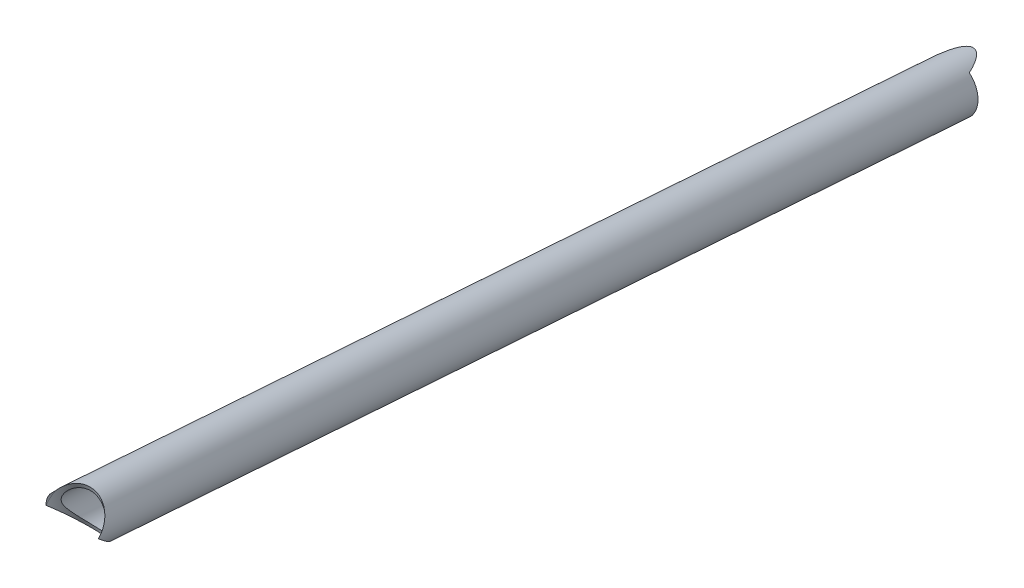
ISO-10303-21;
HEADER;
FILE_DESCRIPTION(('STEP AP214'),'2;1');
FILE_NAME('part.step','',(''),(''),'','','');
FILE_SCHEMA(('AUTOMOTIVE_DESIGN { 1 0 10303 214 1 1 1 1 }'));
ENDSEC;
DATA;
#1=APPLICATION_CONTEXT('core data for automotive mechanical design processes');
#2=APPLICATION_PROTOCOL_DEFINITION('international standard','automotive_design',2000,#1);
#3=PRODUCT_CONTEXT('',#1,'mechanical');
#4=PRODUCT('Part','Part','',(#3));
#5=PRODUCT_RELATED_PRODUCT_CATEGORY('part','',(#4));
#6=PRODUCT_DEFINITION_FORMATION('','',#4);
#7=PRODUCT_DEFINITION_CONTEXT('part definition',#1,'design');
#8=PRODUCT_DEFINITION('design','',#6,#7);
#9=PRODUCT_DEFINITION_SHAPE('','',#8);
#10=(LENGTH_UNIT() NAMED_UNIT(*) SI_UNIT(.MILLI.,.METRE.));
#11=(NAMED_UNIT(*) PLANE_ANGLE_UNIT() SI_UNIT($,.RADIAN.));
#12=(NAMED_UNIT(*) SI_UNIT($,.STERADIAN.) SOLID_ANGLE_UNIT());
#13=UNCERTAINTY_MEASURE_WITH_UNIT(LENGTH_MEASURE(1.E-05),#10,'distance_accuracy_value','');
#14=(GEOMETRIC_REPRESENTATION_CONTEXT(3) GLOBAL_UNCERTAINTY_ASSIGNED_CONTEXT((#13)) GLOBAL_UNIT_ASSIGNED_CONTEXT((#10,
#11,#12)) REPRESENTATION_CONTEXT('',''));
#15=CARTESIAN_POINT('',(0.,0.,0.));
#16=DIRECTION('',(0.,0.,1.));
#17=DIRECTION('',(1.,0.,0.));
#18=AXIS2_PLACEMENT_3D('',#15,#16,#17);
#19=CARTESIAN_POINT('',(250.,220.,-2000.));
#20=DIRECTION('',(0.171152156864514,0.228202875819352,0.958452078441276));
#21=DIRECTION('',(0.,-0.972806214685367,0.23162052730604));
#22=AXIS2_PLACEMENT_3D('',#19,#20,#21);
#23=CYLINDRICAL_SURFACE('',#22,7.90000000000002);
#24=CARTESIAN_POINT('',(322.090271514965,308.435192923939,-1594.46467735048));
#25=CARTESIAN_POINT('',(322.241784424069,308.437647561189,-1594.45437503883));
#26=CARTESIAN_POINT('',(322.392878238035,308.445696040376,-1594.43844222641));
#27=CARTESIAN_POINT('',(322.692760399366,308.472078411791,-1594.39635450053));
#28=CARTESIAN_POINT('',(322.841546469873,308.490421870804,-1594.37019008605));
#29=CARTESIAN_POINT('',(323.284038298838,308.559523009835,-1594.27784641601));
#30=CARTESIAN_POINT('',(323.572805325381,308.624320746827,-1594.19790392637));
#31=CARTESIAN_POINT('',(324.054722667237,308.760796591235,-1594.03670282022));
#32=CARTESIAN_POINT('',(324.252222118965,308.825610351166,-1593.9619284146));
#33=CARTESIAN_POINT('',(324.637930583343,308.967795130276,-1593.80086297085));
#34=CARTESIAN_POINT('',(324.826134260153,309.045173254706,-1593.71456542123));
#35=CARTESIAN_POINT('',(325.193247633719,309.210352161521,-1593.53280337883));
#36=CARTESIAN_POINT('',(325.372155973542,309.298154459517,-1593.43733755342));
#37=CARTESIAN_POINT('',(325.721180146492,309.482578048229,-1593.23903241097));
#38=CARTESIAN_POINT('',(325.891292740669,309.579202551921,-1593.13619041053));
#39=CARTESIAN_POINT('',(326.208618780442,309.771185705104,-1592.93389057627));
#40=CARTESIAN_POINT('',(326.3565325558,309.865913243234,-1592.83492596662));
#41=CARTESIAN_POINT('',(326.64582203285,310.060924626466,-1592.63297131942));
#42=CARTESIAN_POINT('',(326.787196616489,310.161209415334,-1592.52998059901));
#43=CARTESIAN_POINT('',(327.202251729331,310.469641970116,-1592.21598460984));
#44=CARTESIAN_POINT('',(327.4667017636,310.685268169048,-1592.00006092507));
#45=CARTESIAN_POINT('',(327.974771030626,311.134468603766,-1591.55885012381));
#46=CARTESIAN_POINT('',(328.218270744993,311.368133023034,-1591.333518943));
#47=CARTESIAN_POINT('',(328.684756801542,311.850860958247,-1590.87852538884));
#48=CARTESIAN_POINT('',(328.907753127637,312.099916879603,-1590.64886518981));
#49=CARTESIAN_POINT('',(329.23985339802,312.499397263855,-1590.29091252075));
#50=CARTESIAN_POINT('',(329.355598690809,312.644565351914,-1590.16284593537));
#51=CARTESIAN_POINT('',(329.581241912148,312.939773051785,-1589.9071817994));
#52=CARTESIAN_POINT('',(329.691140186099,313.089812374993,-1589.77958422151));
#53=CARTESIAN_POINT('',(329.905242367122,313.395201685107,-1589.52545737269));
#54=CARTESIAN_POINT('',(330.009438796805,313.550558230883,-1589.39892968024));
#55=CARTESIAN_POINT('',(330.211877964759,313.86677721543,-1589.14801013792));
#56=CARTESIAN_POINT('',(330.310120951662,314.027639423831,-1589.02361819901));
#57=CARTESIAN_POINT('',(330.499723879817,314.354235315566,-1588.77893353446));
#58=CARTESIAN_POINT('',(330.591127825265,314.519926188852,-1588.65861793804));
#59=CARTESIAN_POINT('',(330.767380269964,314.857960370392,-1588.42248895494));
#60=CARTESIAN_POINT('',(330.852227518512,315.030304938496,-1588.30667642932));
#61=CARTESIAN_POINT('',(331.014424109215,315.382029870162,-1588.08155727614));
#62=CARTESIAN_POINT('',(331.091789486591,315.56139397498,-1587.97223693782));
#63=CARTESIAN_POINT('',(331.238059322837,315.928304621825,-1587.76210071652));
#64=CARTESIAN_POINT('',(331.306968681726,316.115846338944,-1587.66127991901));
#65=CARTESIAN_POINT('',(331.417234954169,316.447522294866,-1587.49691760675));
#66=CARTESIAN_POINT('',(331.460979314315,316.589537533573,-1587.43071049555));
#67=CARTESIAN_POINT('',(331.542237959927,316.878511221257,-1587.30556754595));
#68=CARTESIAN_POINT('',(331.579752267277,317.025469652868,-1587.24663168201));
#69=CARTESIAN_POINT('',(331.647397964208,317.323879878734,-1587.13758104543));
#70=CARTESIAN_POINT('',(331.677547725234,317.475319413034,-1587.08744441232));
#71=CARTESIAN_POINT('',(331.729376413995,317.782607154821,-1586.9971954167));
#72=CARTESIAN_POINT('',(331.75105577661,317.938455135532,-1586.95708253959));
#73=CARTESIAN_POINT('',(331.784940237742,318.255905353923,-1586.88752862352));
#74=CARTESIAN_POINT('',(331.797006886525,318.417557816483,-1586.85824667898));
#75=CARTESIAN_POINT('',(331.810007160012,318.743048990446,-1586.81180386511));
#76=CARTESIAN_POINT('',(331.810941431322,318.906887574318,-1586.79464229184));
#77=CARTESIAN_POINT('',(331.800893843015,319.235119138201,-1586.77228370522));
#78=CARTESIAN_POINT('',(331.789904221314,319.399512409813,-1586.76709449238));
#79=CARTESIAN_POINT('',(331.755686052502,319.726984076938,-1586.76774419365));
#80=CARTESIAN_POINT('',(331.732457238411,319.89006244369,-1586.77358334834));
#81=CARTESIAN_POINT('',(331.67851476,320.187902060656,-1586.79304418195));
#82=CARTESIAN_POINT('',(331.649555587217,320.323078815993,-1586.80529565071));
#83=CARTESIAN_POINT('',(331.583308621185,320.590759397835,-1586.83538693581));
#84=CARTESIAN_POINT('',(331.546017975102,320.72326229178,-1586.85322866718));
#85=CARTESIAN_POINT('',(331.422098597468,321.116076283602,-1586.91341092174));
#86=CARTESIAN_POINT('',(331.32342711605,321.371667206237,-1586.96240642748));
#87=CARTESIAN_POINT('',(331.124013430922,321.808739960523,-1587.05684874383));
#88=CARTESIAN_POINT('',(331.029266662771,321.993465482926,-1587.10039970959));
#89=CARTESIAN_POINT('',(330.824190701973,322.35360228256,-1587.18975075308));
#90=CARTESIAN_POINT('',(330.713855448883,322.529009900536,-1587.23555170102));
#91=CARTESIAN_POINT('',(330.478707867665,322.870156105225,-1587.32685461971));
#92=CARTESIAN_POINT('',(330.35388091388,323.03588466544,-1587.37235623859));
#93=CARTESIAN_POINT('',(330.090914149447,323.357120412155,-1587.46092700027));
#94=CARTESIAN_POINT('',(329.952773714286,323.512627118589,-1587.50399602883));
#95=CARTESIAN_POINT('',(329.662279459789,323.814988337793,-1587.58653510277));
#96=CARTESIAN_POINT('',(329.509759949811,323.961698944729,-1587.62594917212));
#97=CARTESIAN_POINT('',(329.193172752926,324.243647617584,-1587.69904950772));
#98=CARTESIAN_POINT('',(329.029104837452,324.378885456315,-1587.73273566055));
#99=CARTESIAN_POINT('',(328.690595968018,324.637243256624,-1587.79315802986));
#100=CARTESIAN_POINT('',(328.516159727255,324.760368657665,-1587.81989737494));
#101=CARTESIAN_POINT('',(328.15800675575,324.993945868136,-1587.86546394095));
#102=CARTESIAN_POINT('',(327.974289870416,325.104397466351,-1587.88429103003));
#103=CARTESIAN_POINT('',(327.590511905696,325.316577916171,-1587.91389411448));
#104=CARTESIAN_POINT('',(327.390087330265,325.417705559117,-1587.92427753291));
#105=CARTESIAN_POINT('',(326.981983926491,325.60473813656,-1587.93490978674));
#106=CARTESIAN_POINT('',(326.774304834071,325.690642516211,-1587.93515825284));
#107=CARTESIAN_POINT('',(326.353317193824,325.846576730061,-1587.92509767862));
#108=CARTESIAN_POINT('',(326.140008731097,325.916606804081,-1587.91478879781));
#109=CARTESIAN_POINT('',(325.709461343401,326.040237742945,-1587.88342633818));
#110=CARTESIAN_POINT('',(325.492222597723,326.093839355227,-1587.8623732483));
#111=CARTESIAN_POINT('',(325.065111408071,326.18220872107,-1587.81073034667));
#112=CARTESIAN_POINT('',(324.855332423574,326.217697769979,-1587.78059799172));
#113=CARTESIAN_POINT('',(324.435300000795,326.273005478918,-1587.71080174202));
#114=CARTESIAN_POINT('',(324.225046576758,326.292824603323,-1587.67113812977));
#115=CARTESIAN_POINT('',(323.805596157887,326.316654226663,-1587.58272104175));
#116=CARTESIAN_POINT('',(323.59639900321,326.320667193742,-1587.53396898638));
#117=CARTESIAN_POINT('',(323.1804639997,326.312869787472,-1587.42798831476));
#118=CARTESIAN_POINT('',(322.973726167052,326.30105931005,-1587.37075964275));
#119=CARTESIAN_POINT('',(322.565520265246,326.26183423516,-1587.24905392649));
#120=CARTESIAN_POINT('',(322.364025154853,326.234531344331,-1587.18463139517));
#121=CARTESIAN_POINT('',(321.966001952822,326.16455869142,-1587.04915186586));
#122=CARTESIAN_POINT('',(321.769473838078,326.121889000838,-1586.97809489873));
#123=CARTESIAN_POINT('',(321.382382791046,326.021361959554,-1586.83041467952));
#124=CARTESIAN_POINT('',(321.191822654783,325.963497605785,-1586.75378887262));
#125=CARTESIAN_POINT('',(320.817724446236,325.832812282878,-1586.59627723901));
#126=CARTESIAN_POINT('',(320.634186484944,325.759991077447,-1586.51539134501));
#127=CARTESIAN_POINT('',(320.267446972521,325.596241372426,-1586.34738437441));
#128=CARTESIAN_POINT('',(320.084581278538,325.504682374018,-1586.26014403192));
#129=CARTESIAN_POINT('',(319.728185128106,325.305737841773,-1586.08457065857));
#130=CARTESIAN_POINT('',(319.554655839555,325.198350334191,-1585.99623749268));
#131=CARTESIAN_POINT('',(319.217686319519,324.967901100235,-1585.82081137634));
#132=CARTESIAN_POINT('',(319.054245232834,324.844840705206,-1585.73371832123));
#133=CARTESIAN_POINT('',(318.738111485297,324.583137734261,-1585.56357516237));
#134=CARTESIAN_POINT('',(318.585415643281,324.444499801955,-1585.48052386429));
#135=CARTESIAN_POINT('',(318.328669231755,324.188887671847,-1585.34201164662));
#136=CARTESIAN_POINT('',(318.222099616765,324.07533082292,-1585.28489360551));
#137=CARTESIAN_POINT('',(318.015567669822,323.839735738928,-1585.17652716373));
#138=CARTESIAN_POINT('',(317.9156037867,323.717699508911,-1585.12527738299));
#139=CARTESIAN_POINT('',(317.722749882295,323.465648410996,-1585.03064173473));
#140=CARTESIAN_POINT('',(317.629846647036,323.3356493128,-1584.98724095666));
#141=CARTESIAN_POINT('',(317.451234213236,323.068010180347,-1584.91025274496));
#142=CARTESIAN_POINT('',(317.365523635927,322.930371618951,-1584.87666342747));
#143=CARTESIAN_POINT('',(317.214327676452,322.670257831312,-1584.82562449484));
#144=CARTESIAN_POINT('',(317.147766814519,322.548740046312,-1584.80648000277));
#145=CARTESIAN_POINT('',(317.020179521972,322.30174579289,-1584.77771922889));
#146=CARTESIAN_POINT('',(316.959151982854,322.17627012418,-1584.7681010348));
#147=CARTESIAN_POINT('',(316.842760254209,321.922449983882,-1584.7591577055));
#148=CARTESIAN_POINT('',(316.787392512045,321.79410737429,-1584.75982607301));
#149=CARTESIAN_POINT('',(316.682275069114,321.535627812663,-1584.77177266267));
#150=CARTESIAN_POINT('',(316.632525532451,321.40549080834,-1584.78305119464));
#151=CARTESIAN_POINT('',(316.538679586797,321.145010775517,-1584.81602132804));
#152=CARTESIAN_POINT('',(316.494564743077,321.014669908834,-1584.83767781052));
#153=CARTESIAN_POINT('',(316.411560540613,320.754362690603,-1584.89080815507));
#154=CARTESIAN_POINT('',(316.372671267698,320.624396345241,-1584.92228217836));
#155=CARTESIAN_POINT('',(316.263288397513,320.236017172869,-1585.03024880254));
#156=CARTESIAN_POINT('',(316.200118886293,319.979235671711,-1585.12027074888));
#157=CARTESIAN_POINT('',(316.095328159298,319.496172435106,-1585.31880439655));
#158=CARTESIAN_POINT('',(316.052299919441,319.269195178155,-1585.42499200517));
#159=CARTESIAN_POINT('',(315.978067471013,318.822055321242,-1585.65474181204));
#160=CARTESIAN_POINT('',(315.946873864993,318.60189899346,-1585.77831945468));
#161=CARTESIAN_POINT('',(315.894769247574,318.16700731921,-1586.03897679742));
#162=CARTESIAN_POINT('',(315.873912796367,317.952306294695,-1586.17612365136));
#163=CARTESIAN_POINT('',(315.841732966862,317.528730499196,-1586.45998127141));
#164=CARTESIAN_POINT('',(315.830407061779,317.319854198141,-1586.60668949144));
#165=CARTESIAN_POINT('',(315.81641185208,316.898685836136,-1586.91333285508));
#166=CARTESIAN_POINT('',(315.814111481997,316.686597714791,-1587.07356301785));
#167=CARTESIAN_POINT('',(315.818871801566,316.266934529892,-1587.39974623354));
#168=CARTESIAN_POINT('',(315.825934328586,316.059360360279,-1587.56570040351));
#169=CARTESIAN_POINT('',(315.849406422517,315.647918258108,-1587.90194978006));
#170=CARTESIAN_POINT('',(315.865826461718,315.444054742488,-1588.07224964573));
#171=CARTESIAN_POINT('',(315.908217535997,315.039845067831,-1588.41577278514));
#172=CARTESIAN_POINT('',(315.934187792668,314.839498623524,-1588.58899581951));
#173=CARTESIAN_POINT('',(315.995963932056,314.442777061994,-1588.9366971129));
#174=CARTESIAN_POINT('',(316.031732354511,314.246389817713,-1589.11116817495));
#175=CARTESIAN_POINT('',(316.113740864194,313.856679002332,-1589.46111408126));
#176=CARTESIAN_POINT('',(316.159981813583,313.663355684877,-1589.63658900701));
#177=CARTESIAN_POINT('',(316.263664114113,313.28007122365,-1589.98743057861));
#178=CARTESIAN_POINT('',(316.32109175474,313.090106271596,-1590.16279709603));
#179=CARTESIAN_POINT('',(316.448185027812,312.713562249302,-1590.51267703818));
#180=CARTESIAN_POINT('',(316.517847773638,312.526982391849,-1590.68719065415));
#181=CARTESIAN_POINT('',(316.653018209639,312.200345198492,-1590.99419317008));
#182=CARTESIAN_POINT('',(316.715761796903,312.05950666214,-1591.1270684));
#183=CARTESIAN_POINT('',(316.849941027304,311.780404501318,-1591.3911389592));
#184=CARTESIAN_POINT('',(316.921376392993,311.642140794819,-1591.52233434196));
#185=CARTESIAN_POINT('',(317.07384836779,311.368467868835,-1591.78252490892));
#186=CARTESIAN_POINT('',(317.154896644382,311.233062358036,-1591.91151719749));
#187=CARTESIAN_POINT('',(317.327457742869,310.965914484896,-1592.16627846891));
#188=CARTESIAN_POINT('',(317.418970485442,310.8341720948,-1592.29204747619));
#189=CARTESIAN_POINT('',(317.614745757196,310.573591081519,-1592.54082615892));
#190=CARTESIAN_POINT('',(317.719150512933,310.444807667457,-1592.66378328472));
#191=CARTESIAN_POINT('',(317.940915760671,310.193116380903,-1592.90381466974));
#192=CARTESIAN_POINT('',(318.058279192517,310.070209850758,-1593.02088758524));
#193=CARTESIAN_POINT('',(318.43110835063,309.713299401669,-1593.35996237076));
#194=CARTESIAN_POINT('',(318.70818971018,309.489878785862,-1593.57099615079));
#195=CARTESIAN_POINT('',(319.200724773782,309.172191723297,-1593.8667185847));
#196=CARTESIAN_POINT('',(319.395954444754,309.062180412548,-1593.9680344307));
#197=CARTESIAN_POINT('',(319.704717512891,308.914227364004,-1594.10202488262));
#198=CARTESIAN_POINT('',(319.810310191147,308.867747465404,-1594.14369648794));
#199=CARTESIAN_POINT('',(320.026381217197,308.781134509689,-1594.22037501575));
#200=CARTESIAN_POINT('',(320.13685758868,308.74099891474,-1594.2553846043));
#201=CARTESIAN_POINT('',(320.363028422043,308.667365756628,-1594.31840724843));
#202=CARTESIAN_POINT('',(320.478758323366,308.633925494556,-1594.34636040146));
#203=CARTESIAN_POINT('',(320.713681870427,308.574598879902,-1594.39441919674));
#204=CARTESIAN_POINT('',(320.832873938881,308.548709145032,-1594.4145283541));
#205=CARTESIAN_POINT('',(321.073635621887,308.504784984709,-1594.44664529682));
#206=CARTESIAN_POINT('',(321.195202631825,308.486742408678,-1594.45866149523));
#207=CARTESIAN_POINT('',(321.439717799431,308.458555529761,-1594.47460499558));
#208=CARTESIAN_POINT('',(321.562665207796,308.448407133878,-1594.47853649105));
#209=CARTESIAN_POINT('',(321.753211712874,308.438686717117,-1594.47854111524));
#210=CARTESIAN_POINT('',(321.820696933841,308.436407214997,-1594.47736398183));
#211=CARTESIAN_POINT('',(321.955572822275,308.4341159679,-1594.4727195631));
#212=CARTESIAN_POINT('',(322.022963522535,308.434102477545,-1594.46925404245));
#213=CARTESIAN_POINT('',(322.090271514965,308.435192923939,-1594.46467735048));
#214=B_SPLINE_CURVE_WITH_KNOTS('',3,(#24,#25,#26,#27,#28,#29,#30,#31,#32,#33,#34,#35,#36,#37,
#38,#39,#40,#41,#42,#43,#44,#45,#46,#47,#48,#49,#50,#51,#52,#53,#54,#55,#56,#57,#58,#59,#60,#61,
#62,#63,#64,#65,#66,#67,#68,#69,#70,#71,#72,#73,#74,#75,#76,#77,#78,#79,#80,#81,#82,#83,#84,#85,
#86,#87,#88,#89,#90,#91,#92,#93,#94,#95,#96,#97,#98,#99,#100,#101,#102,#103,#104,#105,#106,#107,
#108,#109,#110,#111,#112,#113,#114,#115,#116,#117,#118,#119,#120,#121,#122,#123,#124,#125,#126,
#127,#128,#129,#130,#131,#132,#133,#134,#135,#136,#137,#138,#139,#140,#141,#142,#143,#144,#145,
#146,#147,#148,#149,#150,#151,#152,#153,#154,#155,#156,#157,#158,#159,#160,#161,#162,#163,#164,
#165,#166,#167,#168,#169,#170,#171,#172,#173,#174,#175,#176,#177,#178,#179,#180,#181,#182,#183,
#184,#185,#186,#187,#188,#189,#190,#191,#192,#193,#194,#195,#196,#197,#198,#199,#200,#201,#202,
#203,#204,#205,#206,#207,#208,#209,#210,#211,#212,#213),.UNSPECIFIED.,.T.,.F.,(4,2,2,2,2,2,2,2,
2,2,2,2,2,2,2,2,2,2,2,2,2,2,2,2,2,2,2,2,2,2,2,2,2,2,2,2,2,2,2,2,2,2,2,2,2,2,2,2,2,2,2,2,2,2,2,2,
2,2,2,2,2,2,2,2,2,2,2,2,2,2,2,2,2,2,2,2,2,2,2,2,2,2,2,2,2,2,2,2,2,2,2,2,2,2,4),(0.,
0.455556686507927,0.91153740939675,1.82668038152642,2.48861513485919,3.1509255298755,
3.81333233898206,4.47598136094282,5.0805600399091,5.68524170877951,6.89525494702621,
8.11176754436254,9.32768460101435,10.0042225757443,10.6807205408311,11.358085390449,
12.0354219320023,12.7079386431843,13.3805833232683,14.0517528592695,14.7225316166747,
15.2102794060413,15.6980254821259,16.1845421178775,16.6710337719974,17.1644116074696,
17.6577607856759,18.1514313116868,18.6451126068625,19.0610588487761,19.4771477364994,
20.3094027889582,20.9450551703967,21.580955362379,22.21750300508,22.8540805216596,
23.4991903445273,24.1443129390576,24.7891444860893,25.4339867779133,26.1073269339189,
26.7806916262677,27.4540461450936,28.1273700240618,28.7712402266173,29.4150913475185,
30.0588419265761,30.7025967396404,31.3417677498906,31.9809357861787,32.6203989271847,
33.2598721714122,33.9261206418016,34.5924522608361,35.2587273155881,35.9248042803722,
36.4220318289941,36.9191421999478,37.4152980693826,37.9113586117967,38.3305118865466,
38.749581004833,39.1683854382162,39.5872021014325,40.0046113932692,40.4220275403097,
41.2572133861242,42.0189061781679,42.7812797620843,43.547635456591,44.3137879070905,
45.1109507174789,45.9082699857072,46.7064833165336,47.5046316019531,48.2997700058723,
49.0949738942194,49.8892092367078,50.6832574470568,51.2936923266094,51.904107725806,
52.515271736012,53.1264311138812,53.7450640692339,54.363837659023,55.5957068048433,
56.3306799000896,56.698286644562,57.065745965615,57.4362270395102,57.8065418991936,
58.176471201473,58.5462085736316,58.7487407679807,58.9511169627786),.UNSPECIFIED.);
#215=CARTESIAN_POINT('',(322.090271514965,308.435192923939,-1594.46467735048));
#216=VERTEX_POINT('',#215);
#217=EDGE_CURVE('E91',#216,#216,#214,.T.);
#218=ORIENTED_EDGE('',*,*,#217,.T.);
#219=EDGE_LOOP('',(#218));
#220=FACE_BOUND('',#219,.T.);
#221=CARTESIAN_POINT('',(257.5,230.,-1958.));
#222=DIRECTION('',(0.,-1.,0.));
#223=DIRECTION('',(0.175790638483658,0.,0.984427575508482));
#224=AXIS2_PLACEMENT_3D('',#221,#222,#223);
#225=ELLIPSE('',#224,34.6183192110767,7.90000000000002);
#226=CARTESIAN_POINT('',(249.317399497778,230.,-1990.));
#227=VERTEX_POINT('',#226);
#228=CARTESIAN_POINT('',(254.867149858445,230.,-1990.));
#229=VERTEX_POINT('',#228);
#230=EDGE_CURVE('E80',#227,#229,#225,.T.);
#231=ORIENTED_EDGE('',*,*,#230,.T.);
#232=CARTESIAN_POINT('',(251.785714285714,222.380952380952,-1990.));
#233=DIRECTION('',(0.,0.,-1.));
#234=DIRECTION('',(0.6,0.8,0.));
#235=AXIS2_PLACEMENT_3D('',#232,#233,#234);
#236=ELLIPSE('',#235,8.24245695501827,7.90000000000002);
#237=EDGE_CURVE('E84',#229,#227,#236,.T.);
#238=ORIENTED_EDGE('',*,*,#237,.T.);
#239=EDGE_LOOP('',(#231,#238));
#240=FACE_BOUND('',#239,.T.);
#241=ADVANCED_FACE('F39',(#220,#240),#23,.F.);
#242=CARTESIAN_POINT('',(325.,320.,-1580.));
#243=DIRECTION('',(-0.214351342090107,-0.914565726251124,-0.342962147344171));
#244=DIRECTION('',(0.,0.351123441588391,-0.936329177569045));
#245=AXIS2_PLACEMENT_3D('',#242,#243,#244);
#246=CYLINDRICAL_SURFACE('',#245,9.49999999999999);
#247=ORIENTED_EDGE('',*,*,#217,.F.);
#248=EDGE_LOOP('',(#247));
#249=FACE_BOUND('',#248,.T.);
#250=CARTESIAN_POINT('',(325.,320.,-1580.));
#251=DIRECTION('',(-0.046806891515563,-0.743683273485426,0.666891523146495));
#252=DIRECTION('',(0.217268286027578,0.644059979147453,0.733472041148959));
#253=AXIS2_PLACEMENT_3D('',#250,#251,#252);
#254=ELLIPSE('',#253,20.5867526008063,9.49999999999999);
#255=CARTESIAN_POINT('',(315.362927698437,320.466468830433,-1580.15621180857));
#256=VERTEX_POINT('',#255);
#257=CARTESIAN_POINT('',(334.262395776099,318.297353717629,-1581.24860727374));
#258=VERTEX_POINT('',#257);
#259=EDGE_CURVE('E140',#256,#258,#254,.T.);
#260=ORIENTED_EDGE('',*,*,#259,.T.);
#261=CARTESIAN_POINT('',(325.,320.,-1580.));
#262=DIRECTION('',(0.217268286027578,0.644059979147453,0.733472041148959));
#263=DIRECTION('',(-0.046806891515563,-0.743683273485426,0.666891523146495));
#264=AXIS2_PLACEMENT_3D('',#261,#262,#263);
#265=ELLIPSE('',#264,10.7083267615423,9.49999999999999);
#266=CARTESIAN_POINT('',(317.012417877542,325.183222265318,-1582.18530176604));
#267=VERTEX_POINT('',#266);
#268=EDGE_CURVE('E142',#258,#267,#265,.T.);
#269=ORIENTED_EDGE('',*,*,#268,.T.);
#270=CARTESIAN_POINT('',(325.,320.,-1580.));
#271=DIRECTION('',(-0.00416950723616232,-0.393939167319851,-0.919127057408686));
#272=DIRECTION('',(0.2871987901008,0.87994037819309,-0.37844654284329));
#273=AXIS2_PLACEMENT_3D('',#270,#271,#272);
#274=ELLIPSE('',#273,14.0448859001954,9.49999999999999);
#275=EDGE_CURVE('E138',#256,#267,#274,.T.);
#276=ORIENTED_EDGE('',*,*,#275,.F.);
#277=EDGE_LOOP('',(#260,#269,#276));
#278=FACE_BOUND('',#277,.T.);
#279=ADVANCED_FACE('F41',(#249,#278),#246,.F.);
#280=CARTESIAN_POINT('',(150.,2.22044604925031E-13,-825.));
#281=DIRECTION('',(0.20871080944,0.381642622975999,-0.900438063583998));
#282=DIRECTION('',(0.,0.920714591276893,0.390236647958419));
#283=AXIS2_PLACEMENT_3D('',#280,#281,#282);
#284=CYLINDRICAL_SURFACE('',#283,9.49999999999999);
#285=CARTESIAN_POINT('',(325.,320.,-1580.));
#286=DIRECTION('',(0.526991553913357,0.846050959333568,0.0804840127897104));
#287=DIRECTION('',(-0.0201323161087032,-0.0822472927426935,0.996408587219418));
#288=AXIS2_PLACEMENT_3D('',#285,#286,#287);
#289=ELLIPSE('',#288,26.3590831761343,9.49999999999999);
#290=CARTESIAN_POINT('',(316.933254371027,325.021925002882,-1579.97139372721));
#291=VERTEX_POINT('',#290);
#292=EDGE_CURVE('E94',#267,#291,#289,.T.);
#293=ORIENTED_EDGE('',*,*,#292,.T.);
#294=CARTESIAN_POINT('',(316.933254371027,325.021925002882,-1579.97139372721));
#295=CARTESIAN_POINT('',(316.902765356402,324.971705671758,-1579.96692700775));
#296=CARTESIAN_POINT('',(316.872626628185,324.921272850539,-1579.96246958194));
#297=CARTESIAN_POINT('',(316.813055811075,324.819990458002,-1579.95356757556));
#298=CARTESIAN_POINT('',(316.783623722182,324.769140886683,-1579.94912299498));
#299=CARTESIAN_POINT('',(316.725472250232,324.66703522404,-1579.94024093699));
#300=CARTESIAN_POINT('',(316.696752867174,324.615779132715,-1579.93580345956));
#301=CARTESIAN_POINT('',(316.640032639435,324.512870794529,-1579.92692986307));
#302=CARTESIAN_POINT('',(316.612031794755,324.461218547668,-1579.922493744));
#303=CARTESIAN_POINT('',(316.556754304274,324.357528357302,-1579.91361711926));
#304=CARTESIAN_POINT('',(316.529477658472,324.305490413797,-1579.9091766136));
#305=CARTESIAN_POINT('',(316.475654031399,324.201039392807,-1579.90028547192));
#306=CARTESIAN_POINT('',(316.449107050128,324.148626315322,-1579.8958348359));
#307=CARTESIAN_POINT('',(316.396748043419,324.0434356791,-1579.88691769197));
#308=CARTESIAN_POINT('',(316.370936017982,323.990658120362,-1579.88245118407));
#309=CARTESIAN_POINT('',(316.320051972207,323.884749293494,-1579.87349656047));
#310=CARTESIAN_POINT('',(316.294979951869,323.831618025363,-1579.86900844478));
#311=CARTESIAN_POINT('',(316.270280458716,323.778315288464,-1579.86450665722));
#312=B_SPLINE_CURVE_WITH_KNOTS('',3,(#294,#295,#296,#297,#298,#299,#300,#301,#302,#303,#304,
#305,#306,#307,#308,#309,#310,#311),.UNSPECIFIED.,.F.,.F.,(4,2,2,2,2,2,2,2,4),(0.,
0.176757206009335,0.353514412018597,0.5302716180279,0.707028824037226,0.883786030046451,
1.06054323605572,1.23730044206504,1.41405764807431),.UNSPECIFIED.);
#313=CARTESIAN_POINT('',(316.270280458716,323.778315288464,-1579.86450665722));
#314=VERTEX_POINT('',#313);
#315=EDGE_CURVE('E132',#291,#314,#312,.T.);
#316=ORIENTED_EDGE('',*,*,#315,.T.);
#317=CARTESIAN_POINT('',(325.,320.,-1580.));
#318=DIRECTION('',(-0.0201323161087032,-0.0822472927426935,0.996408587219418));
#319=DIRECTION('',(0.526991553913357,0.846050959333568,0.0804840127897104));
#320=AXIS2_PLACEMENT_3D('',#317,#318,#319);
#321=ELLIPSE('',#320,10.1844443246886,9.49999999999999);
#322=EDGE_CURVE('E124',#314,#256,#321,.T.);
#323=ORIENTED_EDGE('',*,*,#322,.T.);
#324=ORIENTED_EDGE('',*,*,#275,.T.);
#325=EDGE_LOOP('',(#293,#316,#323,#324));
#326=FACE_BOUND('',#325,.T.);
#327=ADVANCED_FACE('F111',(#326),#284,.F.);
#328=CARTESIAN_POINT('',(250.,220.,-2000.));
#329=DIRECTION('',(0.171152156864514,0.228202875819352,0.958452078441276));
#330=DIRECTION('',(0.,-0.972806214685367,0.23162052730604));
#331=AXIS2_PLACEMENT_3D('',#328,#329,#330);
#332=CYLINDRICAL_SURFACE('',#331,9.49999999999999);
#333=ORIENTED_EDGE('',*,*,#322,.F.);
#334=ORIENTED_EDGE('',*,*,#315,.F.);
#335=ORIENTED_EDGE('',*,*,#292,.F.);
#336=ORIENTED_EDGE('',*,*,#268,.F.);
#337=ORIENTED_EDGE('',*,*,#259,.F.);
#338=EDGE_LOOP('',(#333,#334,#335,#336,#337));
#339=FACE_BOUND('',#338,.T.);
#340=CARTESIAN_POINT('',(251.785714285714,222.380952380952,-1990.));
#341=DIRECTION('',(0.,0.,-1.));
#342=DIRECTION('',(0.6,0.8,0.));
#343=AXIS2_PLACEMENT_3D('',#340,#341,#342);
#344=ELLIPSE('',#343,9.91181532565485,9.49999999999999);
#345=CARTESIAN_POINT('',(258.123863276632,230.,-1990.));
#346=VERTEX_POINT('',#345);
#347=CARTESIAN_POINT('',(246.060686079592,230.,-1990.));
#348=VERTEX_POINT('',#347);
#349=EDGE_CURVE('E11',#346,#348,#344,.T.);
#350=ORIENTED_EDGE('',*,*,#349,.F.);
#351=CARTESIAN_POINT('',(257.5,230.,-1958.));
#352=DIRECTION('',(0.,-1.,0.));
#353=DIRECTION('',(0.175790638483658,0.,0.984427575508482));
#354=AXIS2_PLACEMENT_3D('',#351,#352,#353);
#355=ELLIPSE('',#354,41.6296243677503,9.49999999999999);
#356=EDGE_CURVE('E48',#348,#346,#355,.T.);
#357=ORIENTED_EDGE('',*,*,#356,.F.);
#358=EDGE_LOOP('',(#350,#357));
#359=FACE_BOUND('',#358,.T.);
#360=ADVANCED_FACE('F102',(#339,#359),#332,.T.);
#361=CARTESIAN_POINT('',(-250.,230.,-1990.));
#362=DIRECTION('',(0.,-1.,0.));
#363=DIRECTION('',(0.,0.,-1.));
#364=AXIS2_PLACEMENT_3D('',#361,#362,#363);
#365=PLANE('',#364);
#366=DIRECTION('',(1.,0.,0.));
#367=VECTOR('',#366,1.);
#368=CARTESIAN_POINT('',(-250.,230.,-1990.));
#369=LINE('',#368,#367);
#370=EDGE_CURVE('E60',#348,#227,#369,.T.);
#371=ORIENTED_EDGE('',*,*,#370,.F.);
#372=ORIENTED_EDGE('',*,*,#356,.T.);
#373=EDGE_CURVE('E55',#229,#346,#369,.T.);
#374=ORIENTED_EDGE('',*,*,#373,.F.);
#375=ORIENTED_EDGE('',*,*,#230,.F.);
#376=EDGE_LOOP('',(#371,#372,#374,#375));
#377=FACE_BOUND('',#376,.T.);
#378=ADVANCED_FACE('F81',(#377),#365,.T.);
#379=CARTESIAN_POINT('',(-250.,210.,-1990.));
#380=DIRECTION('',(0.,0.,-1.));
#381=DIRECTION('',(-1.,0.,0.));
#382=AXIS2_PLACEMENT_3D('',#379,#380,#381);
#383=PLANE('',#382);
#384=ORIENTED_EDGE('',*,*,#373,.T.);
#385=ORIENTED_EDGE('',*,*,#349,.T.);
#386=ORIENTED_EDGE('',*,*,#370,.T.);
#387=ORIENTED_EDGE('',*,*,#237,.F.);
#388=EDGE_LOOP('',(#384,#385,#386,#387));
#389=FACE_BOUND('',#388,.T.);
#390=ADVANCED_FACE('F87',(#389),#383,.T.);
#391=CLOSED_SHELL('',(#241,#279,#327,#360,#378,#390));
#392=MANIFOLD_SOLID_BREP('B2',#391);
#393=ADVANCED_BREP_SHAPE_REPRESENTATION('',(#18,#392),#14);
#394=SHAPE_DEFINITION_REPRESENTATION(#9,#393);
ENDSEC;
END-ISO-10303-21;
